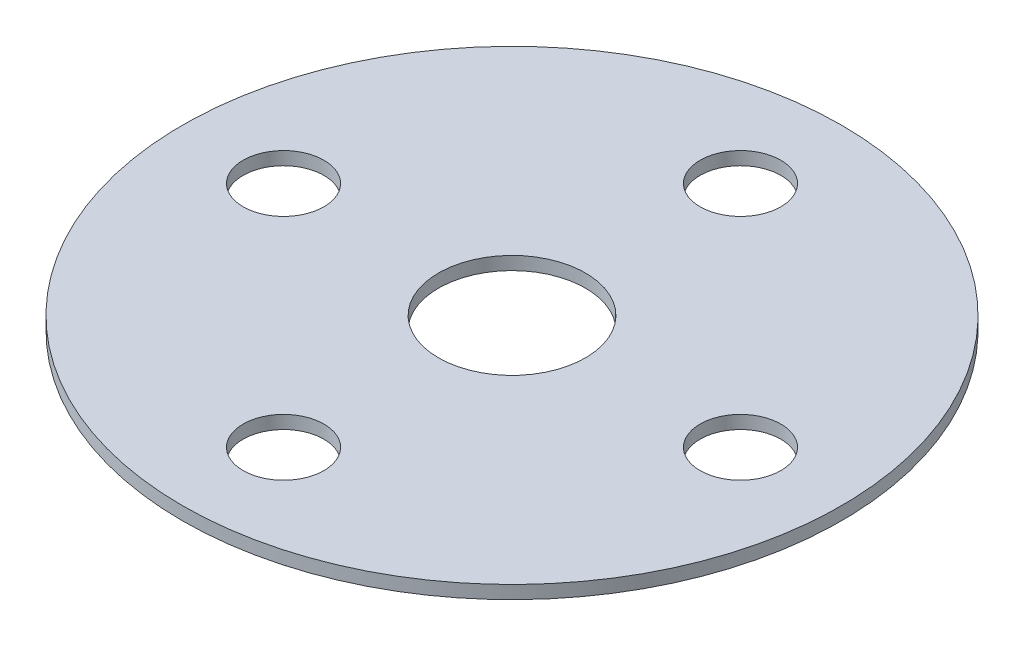
ISO-10303-21;
HEADER;
FILE_DESCRIPTION(('STEP AP214'),'2;1');
FILE_NAME('part.step','',(''),(''),'','','');
FILE_SCHEMA(('AUTOMOTIVE_DESIGN { 1 0 10303 214 1 1 1 1 }'));
ENDSEC;
DATA;
#1=APPLICATION_CONTEXT('core data for automotive mechanical design processes');
#2=APPLICATION_PROTOCOL_DEFINITION('international standard','automotive_design',2000,#1);
#3=PRODUCT_CONTEXT('',#1,'mechanical');
#4=PRODUCT('Part','Part','',(#3));
#5=PRODUCT_RELATED_PRODUCT_CATEGORY('part','',(#4));
#6=PRODUCT_DEFINITION_FORMATION('','',#4);
#7=PRODUCT_DEFINITION_CONTEXT('part definition',#1,'design');
#8=PRODUCT_DEFINITION('design','',#6,#7);
#9=PRODUCT_DEFINITION_SHAPE('','',#8);
#10=(LENGTH_UNIT() NAMED_UNIT(*) SI_UNIT(.MILLI.,.METRE.));
#11=(NAMED_UNIT(*) PLANE_ANGLE_UNIT() SI_UNIT($,.RADIAN.));
#12=(NAMED_UNIT(*) SI_UNIT($,.STERADIAN.) SOLID_ANGLE_UNIT());
#13=UNCERTAINTY_MEASURE_WITH_UNIT(LENGTH_MEASURE(1.E-05),#10,'distance_accuracy_value','');
#14=(GEOMETRIC_REPRESENTATION_CONTEXT(3) GLOBAL_UNCERTAINTY_ASSIGNED_CONTEXT((#13)) GLOBAL_UNIT_ASSIGNED_CONTEXT((#10,
#11,#12)) REPRESENTATION_CONTEXT('',''));
#15=CARTESIAN_POINT('',(0.,0.,0.));
#16=DIRECTION('',(0.,0.,1.));
#17=DIRECTION('',(1.,0.,0.));
#18=AXIS2_PLACEMENT_3D('',#15,#16,#17);
#19=CARTESIAN_POINT('',(0.,0.8636,0.));
#20=DIRECTION('',(0.,1.,0.));
#21=DIRECTION('',(0.,0.,1.));
#22=AXIS2_PLACEMENT_3D('',#19,#20,#21);
#23=PLANE('',#22);
#24=CARTESIAN_POINT('',(0.,0.8636,15.));
#25=DIRECTION('',(0.,1.,0.));
#26=DIRECTION('',(0.,0.,1.));
#27=AXIS2_PLACEMENT_3D('',#24,#25,#26);
#28=CIRCLE('',#27,2.65);
#29=CARTESIAN_POINT('',(0.,0.8636,17.65));
#30=VERTEX_POINT('',#29);
#31=EDGE_CURVE('E75',#30,#30,#28,.T.);
#32=ORIENTED_EDGE('',*,*,#31,.F.);
#33=EDGE_LOOP('',(#32));
#34=FACE_BOUND('',#33,.T.);
#35=CARTESIAN_POINT('',(0.,0.8636,-15.));
#36=DIRECTION('',(0.,1.,0.));
#37=DIRECTION('',(0.,0.,1.));
#38=AXIS2_PLACEMENT_3D('',#35,#36,#37);
#39=CIRCLE('',#38,2.65);
#40=CARTESIAN_POINT('',(0.,0.8636,-12.35));
#41=VERTEX_POINT('',#40);
#42=EDGE_CURVE('E59',#41,#41,#39,.T.);
#43=ORIENTED_EDGE('',*,*,#42,.F.);
#44=EDGE_LOOP('',(#43));
#45=FACE_BOUND('',#44,.T.);
#46=CARTESIAN_POINT('',(0.,0.8636,0.));
#47=DIRECTION('',(0.,1.,0.));
#48=DIRECTION('',(0.,0.,1.));
#49=AXIS2_PLACEMENT_3D('',#46,#47,#48);
#50=CIRCLE('',#49,21.6364);
#51=CARTESIAN_POINT('',(0.,0.8636,21.6364));
#52=VERTEX_POINT('',#51);
#53=EDGE_CURVE('E10',#52,#52,#50,.T.);
#54=ORIENTED_EDGE('',*,*,#53,.T.);
#55=EDGE_LOOP('',(#54));
#56=FACE_BOUND('',#55,.T.);
#57=CARTESIAN_POINT('',(0.,0.8636,0.));
#58=DIRECTION('',(0.,1.,0.));
#59=DIRECTION('',(0.,0.,1.));
#60=AXIS2_PLACEMENT_3D('',#57,#58,#59);
#61=CIRCLE('',#60,4.826);
#62=CARTESIAN_POINT('',(0.,0.8636,4.826));
#63=VERTEX_POINT('',#62);
#64=EDGE_CURVE('E53',#63,#63,#61,.T.);
#65=ORIENTED_EDGE('',*,*,#64,.F.);
#66=EDGE_LOOP('',(#65));
#67=FACE_BOUND('',#66,.T.);
#68=CARTESIAN_POINT('',(15.,0.8636,0.));
#69=DIRECTION('',(0.,1.,0.));
#70=DIRECTION('',(0.,0.,1.));
#71=AXIS2_PLACEMENT_3D('',#68,#69,#70);
#72=CIRCLE('',#71,2.65);
#73=CARTESIAN_POINT('',(15.,0.8636,2.65));
#74=VERTEX_POINT('',#73);
#75=EDGE_CURVE('E67',#74,#74,#72,.T.);
#76=ORIENTED_EDGE('',*,*,#75,.F.);
#77=EDGE_LOOP('',(#76));
#78=FACE_BOUND('',#77,.T.);
#79=CARTESIAN_POINT('',(-15.,0.8636,0.));
#80=DIRECTION('',(0.,1.,0.));
#81=DIRECTION('',(0.,0.,1.));
#82=AXIS2_PLACEMENT_3D('',#79,#80,#81);
#83=CIRCLE('',#82,2.65);
#84=CARTESIAN_POINT('',(-15.,0.8636,2.65));
#85=VERTEX_POINT('',#84);
#86=EDGE_CURVE('E83',#85,#85,#83,.T.);
#87=ORIENTED_EDGE('',*,*,#86,.F.);
#88=EDGE_LOOP('',(#87));
#89=FACE_BOUND('',#88,.T.);
#90=ADVANCED_FACE('F40',(#34,#45,#56,#67,#78,#89),#23,.T.);
#91=CARTESIAN_POINT('',(0.,0.,0.));
#92=DIRECTION('',(0.,1.,0.));
#93=DIRECTION('',(0.,0.,1.));
#94=AXIS2_PLACEMENT_3D('',#91,#92,#93);
#95=PLANE('',#94);
#96=CARTESIAN_POINT('',(0.,0.,0.));
#97=DIRECTION('',(0.,1.,0.));
#98=DIRECTION('',(0.,0.,1.));
#99=AXIS2_PLACEMENT_3D('',#96,#97,#98);
#100=CIRCLE('',#99,21.6364);
#101=CARTESIAN_POINT('',(0.,0.,21.6364));
#102=VERTEX_POINT('',#101);
#103=EDGE_CURVE('E44',#102,#102,#100,.T.);
#104=ORIENTED_EDGE('',*,*,#103,.F.);
#105=EDGE_LOOP('',(#104));
#106=FACE_BOUND('',#105,.T.);
#107=CARTESIAN_POINT('',(0.,0.,0.));
#108=DIRECTION('',(0.,1.,0.));
#109=DIRECTION('',(0.,0.,1.));
#110=AXIS2_PLACEMENT_3D('',#107,#108,#109);
#111=CIRCLE('',#110,4.826);
#112=CARTESIAN_POINT('',(0.,0.,4.826));
#113=VERTEX_POINT('',#112);
#114=EDGE_CURVE('E55',#113,#113,#111,.T.);
#115=ORIENTED_EDGE('',*,*,#114,.T.);
#116=EDGE_LOOP('',(#115));
#117=FACE_BOUND('',#116,.T.);
#118=CARTESIAN_POINT('',(0.,0.,-15.));
#119=DIRECTION('',(0.,1.,0.));
#120=DIRECTION('',(0.,0.,1.));
#121=AXIS2_PLACEMENT_3D('',#118,#119,#120);
#122=CIRCLE('',#121,2.65);
#123=CARTESIAN_POINT('',(0.,0.,-12.35));
#124=VERTEX_POINT('',#123);
#125=EDGE_CURVE('E63',#124,#124,#122,.T.);
#126=ORIENTED_EDGE('',*,*,#125,.T.);
#127=EDGE_LOOP('',(#126));
#128=FACE_BOUND('',#127,.T.);
#129=CARTESIAN_POINT('',(15.,0.,0.));
#130=DIRECTION('',(0.,1.,0.));
#131=DIRECTION('',(0.,0.,1.));
#132=AXIS2_PLACEMENT_3D('',#129,#130,#131);
#133=CIRCLE('',#132,2.65);
#134=CARTESIAN_POINT('',(15.,0.,2.65));
#135=VERTEX_POINT('',#134);
#136=EDGE_CURVE('E71',#135,#135,#133,.T.);
#137=ORIENTED_EDGE('',*,*,#136,.T.);
#138=EDGE_LOOP('',(#137));
#139=FACE_BOUND('',#138,.T.);
#140=CARTESIAN_POINT('',(0.,0.,15.));
#141=DIRECTION('',(0.,1.,0.));
#142=DIRECTION('',(0.,0.,1.));
#143=AXIS2_PLACEMENT_3D('',#140,#141,#142);
#144=CIRCLE('',#143,2.65);
#145=CARTESIAN_POINT('',(0.,0.,17.65));
#146=VERTEX_POINT('',#145);
#147=EDGE_CURVE('E79',#146,#146,#144,.T.);
#148=ORIENTED_EDGE('',*,*,#147,.T.);
#149=EDGE_LOOP('',(#148));
#150=FACE_BOUND('',#149,.T.);
#151=CARTESIAN_POINT('',(-15.,0.,0.));
#152=DIRECTION('',(0.,1.,0.));
#153=DIRECTION('',(0.,0.,1.));
#154=AXIS2_PLACEMENT_3D('',#151,#152,#153);
#155=CIRCLE('',#154,2.65);
#156=CARTESIAN_POINT('',(-15.,0.,2.65));
#157=VERTEX_POINT('',#156);
#158=EDGE_CURVE('E87',#157,#157,#155,.T.);
#159=ORIENTED_EDGE('',*,*,#158,.T.);
#160=EDGE_LOOP('',(#159));
#161=FACE_BOUND('',#160,.T.);
#162=ADVANCED_FACE('F99',(#106,#117,#128,#139,#150,#161),#95,.F.);
#163=CARTESIAN_POINT('',(0.,0.8636,0.));
#164=DIRECTION('',(0.,-1.,0.));
#165=DIRECTION('',(0.,0.,-1.));
#166=AXIS2_PLACEMENT_3D('',#163,#164,#165);
#167=CYLINDRICAL_SURFACE('',#166,21.6364);
#168=ORIENTED_EDGE('',*,*,#53,.F.);
#169=EDGE_LOOP('',(#168));
#170=FACE_BOUND('',#169,.T.);
#171=ORIENTED_EDGE('',*,*,#103,.T.);
#172=EDGE_LOOP('',(#171));
#173=FACE_BOUND('',#172,.T.);
#174=ADVANCED_FACE('F42',(#170,#173),#167,.T.);
#175=CARTESIAN_POINT('',(0.,0.8636,0.));
#176=DIRECTION('',(0.,-1.,0.));
#177=DIRECTION('',(0.,0.,-1.));
#178=AXIS2_PLACEMENT_3D('',#175,#176,#177);
#179=CYLINDRICAL_SURFACE('',#178,4.826);
#180=ORIENTED_EDGE('',*,*,#64,.T.);
#181=EDGE_LOOP('',(#180));
#182=FACE_BOUND('',#181,.T.);
#183=ORIENTED_EDGE('',*,*,#114,.F.);
#184=EDGE_LOOP('',(#183));
#185=FACE_BOUND('',#184,.T.);
#186=ADVANCED_FACE('F109',(#182,#185),#179,.F.);
#187=CARTESIAN_POINT('',(0.,0.8636,-15.));
#188=DIRECTION('',(0.,-1.,0.));
#189=DIRECTION('',(0.,0.,-1.));
#190=AXIS2_PLACEMENT_3D('',#187,#188,#189);
#191=CYLINDRICAL_SURFACE('',#190,2.65);
#192=ORIENTED_EDGE('',*,*,#42,.T.);
#193=EDGE_LOOP('',(#192));
#194=FACE_BOUND('',#193,.T.);
#195=ORIENTED_EDGE('',*,*,#125,.F.);
#196=EDGE_LOOP('',(#195));
#197=FACE_BOUND('',#196,.T.);
#198=ADVANCED_FACE('F112',(#194,#197),#191,.F.);
#199=CARTESIAN_POINT('',(15.,0.8636,0.));
#200=DIRECTION('',(0.,-1.,0.));
#201=DIRECTION('',(0.,0.,-1.));
#202=AXIS2_PLACEMENT_3D('',#199,#200,#201);
#203=CYLINDRICAL_SURFACE('',#202,2.65);
#204=ORIENTED_EDGE('',*,*,#75,.T.);
#205=EDGE_LOOP('',(#204));
#206=FACE_BOUND('',#205,.T.);
#207=ORIENTED_EDGE('',*,*,#136,.F.);
#208=EDGE_LOOP('',(#207));
#209=FACE_BOUND('',#208,.T.);
#210=ADVANCED_FACE('F116',(#206,#209),#203,.F.);
#211=CARTESIAN_POINT('',(0.,0.8636,15.));
#212=DIRECTION('',(0.,-1.,0.));
#213=DIRECTION('',(0.,0.,-1.));
#214=AXIS2_PLACEMENT_3D('',#211,#212,#213);
#215=CYLINDRICAL_SURFACE('',#214,2.65);
#216=ORIENTED_EDGE('',*,*,#31,.T.);
#217=EDGE_LOOP('',(#216));
#218=FACE_BOUND('',#217,.T.);
#219=ORIENTED_EDGE('',*,*,#147,.F.);
#220=EDGE_LOOP('',(#219));
#221=FACE_BOUND('',#220,.T.);
#222=ADVANCED_FACE('F120',(#218,#221),#215,.F.);
#223=CARTESIAN_POINT('',(-15.,0.8636,0.));
#224=DIRECTION('',(0.,-1.,0.));
#225=DIRECTION('',(0.,0.,-1.));
#226=AXIS2_PLACEMENT_3D('',#223,#224,#225);
#227=CYLINDRICAL_SURFACE('',#226,2.65);
#228=ORIENTED_EDGE('',*,*,#86,.T.);
#229=EDGE_LOOP('',(#228));
#230=FACE_BOUND('',#229,.T.);
#231=ORIENTED_EDGE('',*,*,#158,.F.);
#232=EDGE_LOOP('',(#231));
#233=FACE_BOUND('',#232,.T.);
#234=ADVANCED_FACE('F95',(#230,#233),#227,.F.);
#235=CLOSED_SHELL('',(#90,#162,#174,#186,#198,#210,#222,#234));
#236=MANIFOLD_SOLID_BREP('B2',#235);
#237=ADVANCED_BREP_SHAPE_REPRESENTATION('',(#18,#236),#14);
#238=SHAPE_DEFINITION_REPRESENTATION(#9,#237);
ENDSEC;
END-ISO-10303-21;
